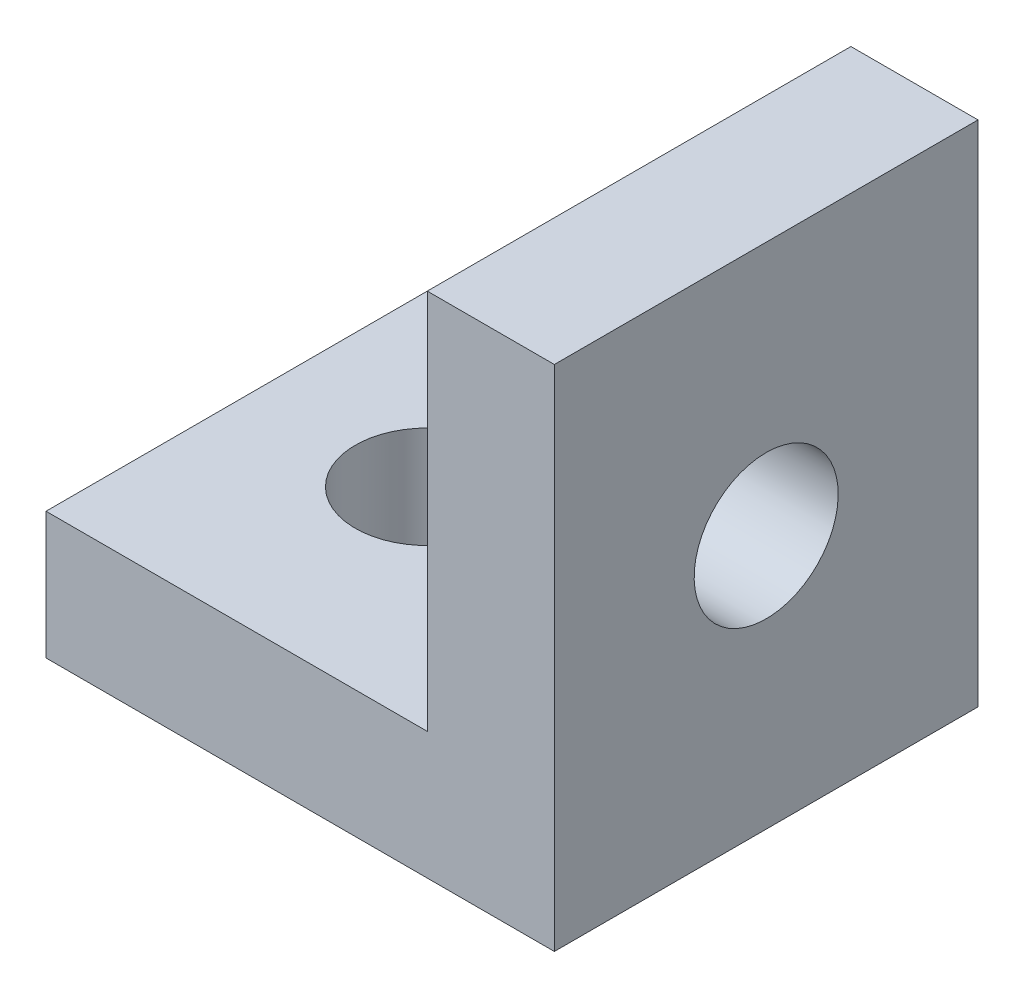
ISO-10303-21;
HEADER;
FILE_DESCRIPTION(('STEP AP214'),'2;1');
FILE_NAME('part.step','',(''),(''),'','','');
FILE_SCHEMA(('AUTOMOTIVE_DESIGN { 1 0 10303 214 1 1 1 1 }'));
ENDSEC;
DATA;
#1=APPLICATION_CONTEXT('core data for automotive mechanical design processes');
#2=APPLICATION_PROTOCOL_DEFINITION('international standard','automotive_design',2000,#1);
#3=PRODUCT_CONTEXT('',#1,'mechanical');
#4=PRODUCT('Part','Part','',(#3));
#5=PRODUCT_RELATED_PRODUCT_CATEGORY('part','',(#4));
#6=PRODUCT_DEFINITION_FORMATION('','',#4);
#7=PRODUCT_DEFINITION_CONTEXT('part definition',#1,'design');
#8=PRODUCT_DEFINITION('design','',#6,#7);
#9=PRODUCT_DEFINITION_SHAPE('','',#8);
#10=(LENGTH_UNIT() NAMED_UNIT(*) SI_UNIT(.MILLI.,.METRE.));
#11=(NAMED_UNIT(*) PLANE_ANGLE_UNIT() SI_UNIT($,.RADIAN.));
#12=(NAMED_UNIT(*) SI_UNIT($,.STERADIAN.) SOLID_ANGLE_UNIT());
#13=UNCERTAINTY_MEASURE_WITH_UNIT(LENGTH_MEASURE(1.E-05),#10,'distance_accuracy_value','');
#14=(GEOMETRIC_REPRESENTATION_CONTEXT(3) GLOBAL_UNCERTAINTY_ASSIGNED_CONTEXT((#13)) GLOBAL_UNIT_ASSIGNED_CONTEXT((#10,
#11,#12)) REPRESENTATION_CONTEXT('',''));
#15=CARTESIAN_POINT('',(0.,0.,0.));
#16=DIRECTION('',(0.,0.,1.));
#17=DIRECTION('',(1.,0.,0.));
#18=AXIS2_PLACEMENT_3D('',#15,#16,#17);
#19=CARTESIAN_POINT('',(27.,-12.,-81.));
#20=DIRECTION('',(-1.,0.,0.));
#21=DIRECTION('',(0.,1.,0.));
#22=AXIS2_PLACEMENT_3D('',#19,#20,#21);
#23=CYLINDRICAL_SURFACE('',#22,1.7);
#24=CARTESIAN_POINT('',(28.,-12.,-81.));
#25=DIRECTION('',(-1.,0.,0.));
#26=DIRECTION('',(0.,1.,0.));
#27=AXIS2_PLACEMENT_3D('',#24,#25,#26);
#28=CIRCLE('',#27,1.7);
#29=CARTESIAN_POINT('',(28.,-10.3,-81.));
#30=VERTEX_POINT('',#29);
#31=EDGE_CURVE('E26',#30,#30,#28,.T.);
#32=ORIENTED_EDGE('',*,*,#31,.T.);
#33=DIRECTION('',(1.,0.,0.));
#34=VECTOR('',#33,1.);
#35=CARTESIAN_POINT('',(27.,-10.3,-81.));
#36=LINE('',#35,#34);
#37=CARTESIAN_POINT('',(31.,-10.3,-81.));
#38=VERTEX_POINT('',#37);
#39=EDGE_CURVE('E11',#30,#38,#36,.T.);
#40=ORIENTED_EDGE('',*,*,#39,.T.);
#41=CARTESIAN_POINT('',(31.,-12.,-81.));
#42=DIRECTION('',(-1.,0.,0.));
#43=DIRECTION('',(0.,1.,0.));
#44=AXIS2_PLACEMENT_3D('',#41,#42,#43);
#45=CIRCLE('',#44,1.7);
#46=EDGE_CURVE('E108',#38,#38,#45,.T.);
#47=ORIENTED_EDGE('',*,*,#46,.F.);
#48=ORIENTED_EDGE('',*,*,#39,.F.);
#49=EDGE_LOOP('',(#32,#40,#47,#48));
#50=FACE_BOUND('',#49,.T.);
#51=ADVANCED_FACE('F17',(#50),#23,.F.);
#52=CARTESIAN_POINT('',(28.,-18.,-86.));
#53=DIRECTION('',(1.,0.,0.));
#54=DIRECTION('',(0.,1.,0.));
#55=AXIS2_PLACEMENT_3D('',#52,#53,#54);
#56=PLANE('',#55);
#57=ORIENTED_EDGE('',*,*,#31,.F.);
#58=EDGE_LOOP('',(#57));
#59=FACE_BOUND('',#58,.T.);
#60=DIRECTION('',(0.,0.,1.));
#61=VECTOR('',#60,1.);
#62=CARTESIAN_POINT('',(28.,-6.,-86.));
#63=LINE('',#62,#61);
#64=CARTESIAN_POINT('',(28.,-6.,-86.));
#65=VERTEX_POINT('',#64);
#66=CARTESIAN_POINT('',(28.,-6.,-76.));
#67=VERTEX_POINT('',#66);
#68=EDGE_CURVE('E107',#65,#67,#63,.T.);
#69=ORIENTED_EDGE('',*,*,#68,.F.);
#70=DIRECTION('',(0.,1.,0.));
#71=VECTOR('',#70,1.);
#72=CARTESIAN_POINT('',(28.,-18.,-86.));
#73=LINE('',#72,#71);
#74=CARTESIAN_POINT('',(28.,-15.,-86.));
#75=VERTEX_POINT('',#74);
#76=EDGE_CURVE('E92',#75,#65,#73,.T.);
#77=ORIENTED_EDGE('',*,*,#76,.F.);
#78=DIRECTION('',(0.,0.,-1.));
#79=VECTOR('',#78,1.);
#80=CARTESIAN_POINT('',(28.,-15.,-86.));
#81=LINE('',#80,#79);
#82=CARTESIAN_POINT('',(28.,-15.,-76.));
#83=VERTEX_POINT('',#82);
#84=EDGE_CURVE('E149',#83,#75,#81,.T.);
#85=ORIENTED_EDGE('',*,*,#84,.F.);
#86=DIRECTION('',(0.,1.,0.));
#87=VECTOR('',#86,1.);
#88=CARTESIAN_POINT('',(28.,-18.,-76.));
#89=LINE('',#88,#87);
#90=EDGE_CURVE('E129',#83,#67,#89,.T.);
#91=ORIENTED_EDGE('',*,*,#90,.T.);
#92=EDGE_LOOP('',(#69,#77,#85,#91));
#93=FACE_BOUND('',#92,.T.);
#94=ADVANCED_FACE('F122',(#59,#93),#56,.F.);
#95=CARTESIAN_POINT('',(28.,-6.,-86.));
#96=DIRECTION('',(0.,1.,0.));
#97=DIRECTION('',(1.,0.,0.));
#98=AXIS2_PLACEMENT_3D('',#95,#96,#97);
#99=PLANE('',#98);
#100=DIRECTION('',(1.,0.,0.));
#101=VECTOR('',#100,1.);
#102=CARTESIAN_POINT('',(28.,-6.,-86.));
#103=LINE('',#102,#101);
#104=CARTESIAN_POINT('',(31.,-6.,-86.));
#105=VERTEX_POINT('',#104);
#106=EDGE_CURVE('E134',#65,#105,#103,.T.);
#107=ORIENTED_EDGE('',*,*,#106,.F.);
#108=ORIENTED_EDGE('',*,*,#68,.T.);
#109=DIRECTION('',(1.,0.,0.));
#110=VECTOR('',#109,1.);
#111=CARTESIAN_POINT('',(28.,-6.,-76.));
#112=LINE('',#111,#110);
#113=CARTESIAN_POINT('',(31.,-6.,-76.));
#114=VERTEX_POINT('',#113);
#115=EDGE_CURVE('E156',#67,#114,#112,.T.);
#116=ORIENTED_EDGE('',*,*,#115,.T.);
#117=DIRECTION('',(0.,0.,1.));
#118=VECTOR('',#117,1.);
#119=CARTESIAN_POINT('',(31.,-6.,-86.));
#120=LINE('',#119,#118);
#121=EDGE_CURVE('E115',#105,#114,#120,.T.);
#122=ORIENTED_EDGE('',*,*,#121,.F.);
#123=EDGE_LOOP('',(#107,#108,#116,#122));
#124=FACE_BOUND('',#123,.T.);
#125=ADVANCED_FACE('F124',(#124),#99,.T.);
#126=CARTESIAN_POINT('',(23.,-13.,-81.));
#127=DIRECTION('',(0.,1.,0.));
#128=DIRECTION('',(1.,0.,0.));
#129=AXIS2_PLACEMENT_3D('',#126,#127,#128);
#130=CYLINDRICAL_SURFACE('',#129,1.7);
#131=CARTESIAN_POINT('',(23.,-15.,-81.));
#132=DIRECTION('',(0.,1.,0.));
#133=DIRECTION('',(1.,0.,0.));
#134=AXIS2_PLACEMENT_3D('',#131,#132,#133);
#135=CIRCLE('',#134,1.7);
#136=CARTESIAN_POINT('',(24.7,-15.,-81.));
#137=VERTEX_POINT('',#136);
#138=EDGE_CURVE('E103',#137,#137,#135,.T.);
#139=ORIENTED_EDGE('',*,*,#138,.T.);
#140=DIRECTION('',(0.,-1.,0.));
#141=VECTOR('',#140,1.);
#142=CARTESIAN_POINT('',(24.7,-13.,-81.));
#143=LINE('',#142,#141);
#144=CARTESIAN_POINT('',(24.7,-18.,-81.));
#145=VERTEX_POINT('',#144);
#146=EDGE_CURVE('E100',#137,#145,#143,.T.);
#147=ORIENTED_EDGE('',*,*,#146,.T.);
#148=CARTESIAN_POINT('',(23.,-18.,-81.));
#149=DIRECTION('',(0.,1.,0.));
#150=DIRECTION('',(1.,0.,0.));
#151=AXIS2_PLACEMENT_3D('',#148,#149,#150);
#152=CIRCLE('',#151,1.7);
#153=EDGE_CURVE('E105',#145,#145,#152,.T.);
#154=ORIENTED_EDGE('',*,*,#153,.F.);
#155=ORIENTED_EDGE('',*,*,#146,.F.);
#156=EDGE_LOOP('',(#139,#147,#154,#155));
#157=FACE_BOUND('',#156,.T.);
#158=ADVANCED_FACE('F101',(#157),#130,.F.);
#159=CARTESIAN_POINT('',(31.,-18.,-86.));
#160=DIRECTION('',(1.,0.,0.));
#161=DIRECTION('',(0.,1.,0.));
#162=AXIS2_PLACEMENT_3D('',#159,#160,#161);
#163=PLANE('',#162);
#164=ORIENTED_EDGE('',*,*,#46,.T.);
#165=EDGE_LOOP('',(#164));
#166=FACE_BOUND('',#165,.T.);
#167=DIRECTION('',(0.,0.,1.));
#168=VECTOR('',#167,1.);
#169=CARTESIAN_POINT('',(31.,-18.,-86.));
#170=LINE('',#169,#168);
#171=CARTESIAN_POINT('',(31.,-18.,-86.));
#172=VERTEX_POINT('',#171);
#173=CARTESIAN_POINT('',(31.,-18.,-76.));
#174=VERTEX_POINT('',#173);
#175=EDGE_CURVE('E174',#172,#174,#170,.T.);
#176=ORIENTED_EDGE('',*,*,#175,.F.);
#177=DIRECTION('',(0.,-1.,0.));
#178=VECTOR('',#177,1.);
#179=CARTESIAN_POINT('',(31.,-6.,-86.));
#180=LINE('',#179,#178);
#181=EDGE_CURVE('E138',#105,#172,#180,.T.);
#182=ORIENTED_EDGE('',*,*,#181,.F.);
#183=ORIENTED_EDGE('',*,*,#121,.T.);
#184=DIRECTION('',(0.,1.,0.));
#185=VECTOR('',#184,1.);
#186=CARTESIAN_POINT('',(31.,-18.,-76.));
#187=LINE('',#186,#185);
#188=EDGE_CURVE('E159',#174,#114,#187,.T.);
#189=ORIENTED_EDGE('',*,*,#188,.F.);
#190=EDGE_LOOP('',(#176,#182,#183,#189));
#191=FACE_BOUND('',#190,.T.);
#192=ADVANCED_FACE('F202',(#166,#191),#163,.T.);
#193=CARTESIAN_POINT('',(19.,-18.,-86.));
#194=DIRECTION('',(0.,0.,1.));
#195=DIRECTION('',(1.,0.,0.));
#196=AXIS2_PLACEMENT_3D('',#193,#194,#195);
#197=PLANE('',#196);
#198=ORIENTED_EDGE('',*,*,#76,.T.);
#199=ORIENTED_EDGE('',*,*,#106,.T.);
#200=ORIENTED_EDGE('',*,*,#181,.T.);
#201=DIRECTION('',(1.,0.,0.));
#202=VECTOR('',#201,1.);
#203=CARTESIAN_POINT('',(19.,-18.,-86.));
#204=LINE('',#203,#202);
#205=CARTESIAN_POINT('',(19.,-18.,-86.));
#206=VERTEX_POINT('',#205);
#207=EDGE_CURVE('E185',#206,#172,#204,.T.);
#208=ORIENTED_EDGE('',*,*,#207,.F.);
#209=DIRECTION('',(0.,1.,0.));
#210=VECTOR('',#209,1.);
#211=CARTESIAN_POINT('',(19.,-18.,-86.));
#212=LINE('',#211,#210);
#213=CARTESIAN_POINT('',(19.,-15.,-86.));
#214=VERTEX_POINT('',#213);
#215=EDGE_CURVE('E162',#206,#214,#212,.T.);
#216=ORIENTED_EDGE('',*,*,#215,.T.);
#217=DIRECTION('',(1.,0.,0.));
#218=VECTOR('',#217,1.);
#219=CARTESIAN_POINT('',(19.,-15.,-86.));
#220=LINE('',#219,#218);
#221=EDGE_CURVE('E143',#214,#75,#220,.T.);
#222=ORIENTED_EDGE('',*,*,#221,.T.);
#223=EDGE_LOOP('',(#198,#199,#200,#208,#216,#222));
#224=FACE_BOUND('',#223,.T.);
#225=ADVANCED_FACE('F141',(#224),#197,.F.);
#226=CARTESIAN_POINT('',(19.,-15.,-86.));
#227=DIRECTION('',(0.,1.,0.));
#228=DIRECTION('',(1.,0.,0.));
#229=AXIS2_PLACEMENT_3D('',#226,#227,#228);
#230=PLANE('',#229);
#231=ORIENTED_EDGE('',*,*,#138,.F.);
#232=EDGE_LOOP('',(#231));
#233=FACE_BOUND('',#232,.T.);
#234=ORIENTED_EDGE('',*,*,#221,.F.);
#235=DIRECTION('',(0.,0.,1.));
#236=VECTOR('',#235,1.);
#237=CARTESIAN_POINT('',(19.,-15.,-86.));
#238=LINE('',#237,#236);
#239=CARTESIAN_POINT('',(19.,-15.,-76.));
#240=VERTEX_POINT('',#239);
#241=EDGE_CURVE('E155',#214,#240,#238,.T.);
#242=ORIENTED_EDGE('',*,*,#241,.T.);
#243=DIRECTION('',(1.,0.,0.));
#244=VECTOR('',#243,1.);
#245=CARTESIAN_POINT('',(19.,-15.,-76.));
#246=LINE('',#245,#244);
#247=EDGE_CURVE('E167',#240,#83,#246,.T.);
#248=ORIENTED_EDGE('',*,*,#247,.T.);
#249=ORIENTED_EDGE('',*,*,#84,.T.);
#250=EDGE_LOOP('',(#234,#242,#248,#249));
#251=FACE_BOUND('',#250,.T.);
#252=ADVANCED_FACE('F215',(#233,#251),#230,.T.);
#253=CARTESIAN_POINT('',(19.,-18.,-76.));
#254=DIRECTION('',(0.,0.,1.));
#255=DIRECTION('',(1.,0.,0.));
#256=AXIS2_PLACEMENT_3D('',#253,#254,#255);
#257=PLANE('',#256);
#258=ORIENTED_EDGE('',*,*,#247,.F.);
#259=DIRECTION('',(0.,1.,0.));
#260=VECTOR('',#259,1.);
#261=CARTESIAN_POINT('',(19.,-18.,-76.));
#262=LINE('',#261,#260);
#263=CARTESIAN_POINT('',(19.,-18.,-76.));
#264=VERTEX_POINT('',#263);
#265=EDGE_CURVE('E152',#264,#240,#262,.T.);
#266=ORIENTED_EDGE('',*,*,#265,.F.);
#267=DIRECTION('',(-1.,0.,0.));
#268=VECTOR('',#267,1.);
#269=CARTESIAN_POINT('',(31.,-18.,-76.));
#270=LINE('',#269,#268);
#271=EDGE_CURVE('E181',#174,#264,#270,.T.);
#272=ORIENTED_EDGE('',*,*,#271,.F.);
#273=ORIENTED_EDGE('',*,*,#188,.T.);
#274=ORIENTED_EDGE('',*,*,#115,.F.);
#275=ORIENTED_EDGE('',*,*,#90,.F.);
#276=EDGE_LOOP('',(#258,#266,#272,#273,#274,#275));
#277=FACE_BOUND('',#276,.T.);
#278=ADVANCED_FACE('F205',(#277),#257,.T.);
#279=CARTESIAN_POINT('',(19.,-18.,-86.));
#280=DIRECTION('',(0.,1.,0.));
#281=DIRECTION('',(1.,0.,0.));
#282=AXIS2_PLACEMENT_3D('',#279,#280,#281);
#283=PLANE('',#282);
#284=ORIENTED_EDGE('',*,*,#153,.T.);
#285=EDGE_LOOP('',(#284));
#286=FACE_BOUND('',#285,.T.);
#287=ORIENTED_EDGE('',*,*,#175,.T.);
#288=ORIENTED_EDGE('',*,*,#271,.T.);
#289=DIRECTION('',(0.,0.,1.));
#290=VECTOR('',#289,1.);
#291=CARTESIAN_POINT('',(19.,-18.,-86.));
#292=LINE('',#291,#290);
#293=EDGE_CURVE('E166',#206,#264,#292,.T.);
#294=ORIENTED_EDGE('',*,*,#293,.F.);
#295=ORIENTED_EDGE('',*,*,#207,.T.);
#296=EDGE_LOOP('',(#287,#288,#294,#295));
#297=FACE_BOUND('',#296,.T.);
#298=ADVANCED_FACE('F209',(#286,#297),#283,.F.);
#299=CARTESIAN_POINT('',(19.,-18.,-86.));
#300=DIRECTION('',(1.,0.,0.));
#301=DIRECTION('',(0.,1.,0.));
#302=AXIS2_PLACEMENT_3D('',#299,#300,#301);
#303=PLANE('',#302);
#304=ORIENTED_EDGE('',*,*,#265,.T.);
#305=ORIENTED_EDGE('',*,*,#241,.F.);
#306=ORIENTED_EDGE('',*,*,#215,.F.);
#307=ORIENTED_EDGE('',*,*,#293,.T.);
#308=EDGE_LOOP('',(#304,#305,#306,#307));
#309=FACE_BOUND('',#308,.T.);
#310=ADVANCED_FACE('F213',(#309),#303,.F.);
#311=CLOSED_SHELL('',(#51,#94,#125,#158,#192,#225,#252,#278,#298,#310));
#312=MANIFOLD_SOLID_BREP('B1',#311);
#313=ADVANCED_BREP_SHAPE_REPRESENTATION('',(#18,#312),#14);
#314=SHAPE_DEFINITION_REPRESENTATION(#9,#313);
ENDSEC;
END-ISO-10303-21;
